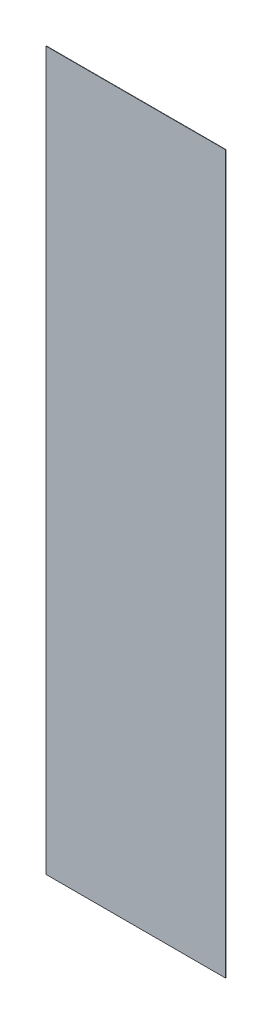
ISO-10303-21;
HEADER;
FILE_DESCRIPTION(('STEP AP214'),'2;1');
FILE_NAME('part.step','',(''),(''),'','','');
FILE_SCHEMA(('AUTOMOTIVE_DESIGN { 1 0 10303 214 1 1 1 1 }'));
ENDSEC;
DATA;
#1=APPLICATION_CONTEXT('core data for automotive mechanical design processes');
#2=APPLICATION_PROTOCOL_DEFINITION('international standard','automotive_design',2000,#1);
#3=PRODUCT_CONTEXT('',#1,'mechanical');
#4=PRODUCT('Part','Part','',(#3));
#5=PRODUCT_RELATED_PRODUCT_CATEGORY('part','',(#4));
#6=PRODUCT_DEFINITION_FORMATION('','',#4);
#7=PRODUCT_DEFINITION_CONTEXT('part definition',#1,'design');
#8=PRODUCT_DEFINITION('design','',#6,#7);
#9=PRODUCT_DEFINITION_SHAPE('','',#8);
#10=(LENGTH_UNIT() NAMED_UNIT(*) SI_UNIT(.MILLI.,.METRE.));
#11=(NAMED_UNIT(*) PLANE_ANGLE_UNIT() SI_UNIT($,.RADIAN.));
#12=(NAMED_UNIT(*) SI_UNIT($,.STERADIAN.) SOLID_ANGLE_UNIT());
#13=UNCERTAINTY_MEASURE_WITH_UNIT(LENGTH_MEASURE(1.E-05),#10,'distance_accuracy_value','');
#14=(GEOMETRIC_REPRESENTATION_CONTEXT(3) GLOBAL_UNCERTAINTY_ASSIGNED_CONTEXT((#13)) GLOBAL_UNIT_ASSIGNED_CONTEXT((#10,
#11,#12)) REPRESENTATION_CONTEXT('',''));
#15=CARTESIAN_POINT('',(0.,0.,0.));
#16=DIRECTION('',(0.,0.,1.));
#17=DIRECTION('',(1.,0.,0.));
#18=AXIS2_PLACEMENT_3D('',#15,#16,#17);
#19=CARTESIAN_POINT('',(3.175,-12.7127,0.0127));
#20=DIRECTION('',(-1.,0.,0.));
#21=DIRECTION('',(0.,0.,1.));
#22=AXIS2_PLACEMENT_3D('',#19,#20,#21);
#23=PLANE('',#22);
#24=DIRECTION('',(0.,1.,0.));
#25=VECTOR('',#24,1.);
#26=CARTESIAN_POINT('',(3.175,-12.7127,0.));
#27=LINE('',#26,#25);
#28=CARTESIAN_POINT('',(3.175,-12.7127,0.));
#29=VERTEX_POINT('',#28);
#30=CARTESIAN_POINT('',(3.175,12.7127,0.));
#31=VERTEX_POINT('',#30);
#32=EDGE_CURVE('E96',#29,#31,#27,.T.);
#33=ORIENTED_EDGE('',*,*,#32,.T.);
#34=DIRECTION('',(0.,0.,-1.));
#35=VECTOR('',#34,1.);
#36=CARTESIAN_POINT('',(3.175,12.7127,0.0127));
#37=LINE('',#36,#35);
#38=CARTESIAN_POINT('',(3.175,12.7127,0.0127));
#39=VERTEX_POINT('',#38);
#40=EDGE_CURVE('E11',#39,#31,#37,.T.);
#41=ORIENTED_EDGE('',*,*,#40,.F.);
#42=DIRECTION('',(0.,1.,0.));
#43=VECTOR('',#42,1.);
#44=CARTESIAN_POINT('',(3.175,-12.7127,0.0127));
#45=LINE('',#44,#43);
#46=CARTESIAN_POINT('',(3.175,-12.7127,0.0127));
#47=VERTEX_POINT('',#46);
#48=EDGE_CURVE('E84',#47,#39,#45,.T.);
#49=ORIENTED_EDGE('',*,*,#48,.F.);
#50=DIRECTION('',(0.,0.,-1.));
#51=VECTOR('',#50,1.);
#52=CARTESIAN_POINT('',(3.175,-12.7127,0.0127));
#53=LINE('',#52,#51);
#54=EDGE_CURVE('E92',#47,#29,#53,.T.);
#55=ORIENTED_EDGE('',*,*,#54,.T.);
#56=EDGE_LOOP('',(#33,#41,#49,#55));
#57=FACE_BOUND('',#56,.T.);
#58=ADVANCED_FACE('F33',(#57),#23,.F.);
#59=CARTESIAN_POINT('',(-3.175,12.7127,0.0127));
#60=DIRECTION('',(0.,-1.,0.));
#61=DIRECTION('',(0.,0.,-1.));
#62=AXIS2_PLACEMENT_3D('',#59,#60,#61);
#63=PLANE('',#62);
#64=DIRECTION('',(-1.,0.,0.));
#65=VECTOR('',#64,1.);
#66=CARTESIAN_POINT('',(-3.175,12.7127,0.));
#67=LINE('',#66,#65);
#68=CARTESIAN_POINT('',(-3.175,12.7127,0.));
#69=VERTEX_POINT('',#68);
#70=EDGE_CURVE('E88',#31,#69,#67,.T.);
#71=ORIENTED_EDGE('',*,*,#70,.T.);
#72=DIRECTION('',(0.,0.,-1.));
#73=VECTOR('',#72,1.);
#74=CARTESIAN_POINT('',(-3.175,12.7127,0.0127));
#75=LINE('',#74,#73);
#76=CARTESIAN_POINT('',(-3.175,12.7127,0.0127));
#77=VERTEX_POINT('',#76);
#78=EDGE_CURVE('E41',#77,#69,#75,.T.);
#79=ORIENTED_EDGE('',*,*,#78,.F.);
#80=DIRECTION('',(-1.,0.,0.));
#81=VECTOR('',#80,1.);
#82=CARTESIAN_POINT('',(-3.175,12.7127,0.0127));
#83=LINE('',#82,#81);
#84=EDGE_CURVE('E79',#39,#77,#83,.T.);
#85=ORIENTED_EDGE('',*,*,#84,.F.);
#86=ORIENTED_EDGE('',*,*,#40,.T.);
#87=EDGE_LOOP('',(#71,#79,#85,#86));
#88=FACE_BOUND('',#87,.T.);
#89=ADVANCED_FACE('F87',(#88),#63,.F.);
#90=CARTESIAN_POINT('',(-3.175,-12.7127,0.0127));
#91=DIRECTION('',(1.,0.,0.));
#92=DIRECTION('',(0.,0.,-1.));
#93=AXIS2_PLACEMENT_3D('',#90,#91,#92);
#94=PLANE('',#93);
#95=DIRECTION('',(0.,-1.,0.));
#96=VECTOR('',#95,1.);
#97=CARTESIAN_POINT('',(-3.175,-12.7127,0.));
#98=LINE('',#97,#96);
#99=CARTESIAN_POINT('',(-3.175,-12.7127,0.));
#100=VERTEX_POINT('',#99);
#101=EDGE_CURVE('E66',#69,#100,#98,.T.);
#102=ORIENTED_EDGE('',*,*,#101,.T.);
#103=DIRECTION('',(0.,0.,-1.));
#104=VECTOR('',#103,1.);
#105=CARTESIAN_POINT('',(-3.175,-12.7127,0.0127));
#106=LINE('',#105,#104);
#107=CARTESIAN_POINT('',(-3.175,-12.7127,0.0127));
#108=VERTEX_POINT('',#107);
#109=EDGE_CURVE('E89',#108,#100,#106,.T.);
#110=ORIENTED_EDGE('',*,*,#109,.F.);
#111=DIRECTION('',(0.,-1.,0.));
#112=VECTOR('',#111,1.);
#113=CARTESIAN_POINT('',(-3.175,-12.7127,0.0127));
#114=LINE('',#113,#112);
#115=EDGE_CURVE('E82',#77,#108,#114,.T.);
#116=ORIENTED_EDGE('',*,*,#115,.F.);
#117=ORIENTED_EDGE('',*,*,#78,.T.);
#118=EDGE_LOOP('',(#102,#110,#116,#117));
#119=FACE_BOUND('',#118,.T.);
#120=ADVANCED_FACE('F90',(#119),#94,.F.);
#121=CARTESIAN_POINT('',(-3.175,-12.7127,0.0127));
#122=DIRECTION('',(0.,1.,0.));
#123=DIRECTION('',(0.,0.,1.));
#124=AXIS2_PLACEMENT_3D('',#121,#122,#123);
#125=PLANE('',#124);
#126=DIRECTION('',(1.,0.,0.));
#127=VECTOR('',#126,1.);
#128=CARTESIAN_POINT('',(-3.175,-12.7127,0.));
#129=LINE('',#128,#127);
#130=EDGE_CURVE('E72',#100,#29,#129,.T.);
#131=ORIENTED_EDGE('',*,*,#130,.T.);
#132=ORIENTED_EDGE('',*,*,#54,.F.);
#133=DIRECTION('',(1.,0.,0.));
#134=VECTOR('',#133,1.);
#135=CARTESIAN_POINT('',(-3.175,-12.7127,0.0127));
#136=LINE('',#135,#134);
#137=EDGE_CURVE('E49',#108,#47,#136,.T.);
#138=ORIENTED_EDGE('',*,*,#137,.F.);
#139=ORIENTED_EDGE('',*,*,#109,.T.);
#140=EDGE_LOOP('',(#131,#132,#138,#139));
#141=FACE_BOUND('',#140,.T.);
#142=ADVANCED_FACE('F103',(#141),#125,.F.);
#143=CARTESIAN_POINT('',(0.,0.,0.0127));
#144=DIRECTION('',(0.,0.,-1.));
#145=DIRECTION('',(-1.,0.,0.));
#146=AXIS2_PLACEMENT_3D('',#143,#144,#145);
#147=PLANE('',#146);
#148=ORIENTED_EDGE('',*,*,#48,.T.);
#149=ORIENTED_EDGE('',*,*,#84,.T.);
#150=ORIENTED_EDGE('',*,*,#115,.T.);
#151=ORIENTED_EDGE('',*,*,#137,.T.);
#152=EDGE_LOOP('',(#148,#149,#150,#151));
#153=FACE_BOUND('',#152,.T.);
#154=ADVANCED_FACE('F80',(#153),#147,.F.);
#155=CARTESIAN_POINT('',(0.,0.,0.));
#156=DIRECTION('',(0.,0.,-1.));
#157=DIRECTION('',(-1.,0.,0.));
#158=AXIS2_PLACEMENT_3D('',#155,#156,#157);
#159=PLANE('',#158);
#160=ORIENTED_EDGE('',*,*,#32,.F.);
#161=ORIENTED_EDGE('',*,*,#130,.F.);
#162=ORIENTED_EDGE('',*,*,#101,.F.);
#163=ORIENTED_EDGE('',*,*,#70,.F.);
#164=EDGE_LOOP('',(#160,#161,#162,#163));
#165=FACE_BOUND('',#164,.T.);
#166=ADVANCED_FACE('F106',(#165),#159,.T.);
#167=CLOSED_SHELL('',(#58,#89,#120,#142,#154,#166));
#168=MANIFOLD_SOLID_BREP('B2',#167);
#169=ADVANCED_BREP_SHAPE_REPRESENTATION('',(#18,#168),#14);
#170=SHAPE_DEFINITION_REPRESENTATION(#9,#169);
ENDSEC;
END-ISO-10303-21;
